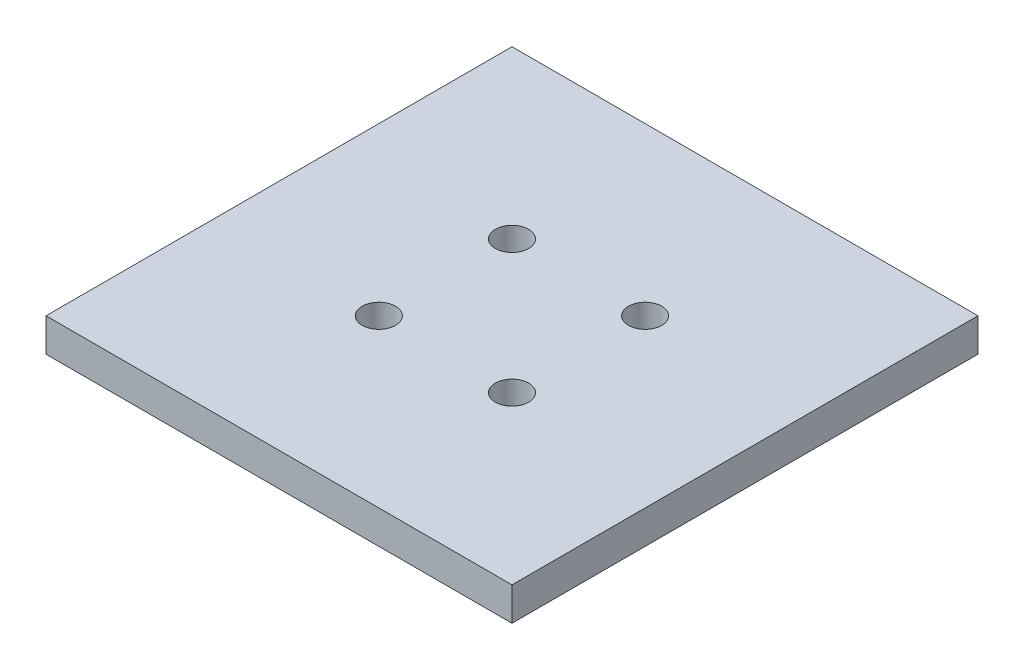
ISO-10303-21;
HEADER;
FILE_DESCRIPTION(('STEP AP214'),'2;1');
FILE_NAME('part.step','',(''),(''),'','','');
FILE_SCHEMA(('AUTOMOTIVE_DESIGN { 1 0 10303 214 1 1 1 1 }'));
ENDSEC;
DATA;
#1=APPLICATION_CONTEXT('core data for automotive mechanical design processes');
#2=APPLICATION_PROTOCOL_DEFINITION('international standard','automotive_design',2000,#1);
#3=PRODUCT_CONTEXT('',#1,'mechanical');
#4=PRODUCT('Part','Part','',(#3));
#5=PRODUCT_RELATED_PRODUCT_CATEGORY('part','',(#4));
#6=PRODUCT_DEFINITION_FORMATION('','',#4);
#7=PRODUCT_DEFINITION_CONTEXT('part definition',#1,'design');
#8=PRODUCT_DEFINITION('design','',#6,#7);
#9=PRODUCT_DEFINITION_SHAPE('','',#8);
#10=(LENGTH_UNIT() NAMED_UNIT(*) SI_UNIT(.MILLI.,.METRE.));
#11=(NAMED_UNIT(*) PLANE_ANGLE_UNIT() SI_UNIT($,.RADIAN.));
#12=(NAMED_UNIT(*) SI_UNIT($,.STERADIAN.) SOLID_ANGLE_UNIT());
#13=UNCERTAINTY_MEASURE_WITH_UNIT(LENGTH_MEASURE(1.E-05),#10,'distance_accuracy_value','');
#14=(GEOMETRIC_REPRESENTATION_CONTEXT(3) GLOBAL_UNCERTAINTY_ASSIGNED_CONTEXT((#13)) GLOBAL_UNIT_ASSIGNED_CONTEXT((#10,
#11,#12)) REPRESENTATION_CONTEXT('',''));
#15=CARTESIAN_POINT('',(0.,0.,0.));
#16=DIRECTION('',(0.,0.,1.));
#17=DIRECTION('',(1.,0.,0.));
#18=AXIS2_PLACEMENT_3D('',#15,#16,#17);
#19=CARTESIAN_POINT('',(0.,6.35,0.));
#20=DIRECTION('',(0.,-1.,0.));
#21=DIRECTION('',(0.,0.,-1.));
#22=AXIS2_PLACEMENT_3D('',#19,#20,#21);
#23=PLANE('',#22);
#24=DIRECTION('',(0.,0.,-1.));
#25=VECTOR('',#24,1.);
#26=CARTESIAN_POINT('',(44.45,6.35,44.45));
#27=LINE('',#26,#25);
#28=CARTESIAN_POINT('',(44.45,6.35,44.45));
#29=VERTEX_POINT('',#28);
#30=CARTESIAN_POINT('',(44.45,6.35,-44.45));
#31=VERTEX_POINT('',#30);
#32=EDGE_CURVE('E92',#29,#31,#27,.T.);
#33=ORIENTED_EDGE('',*,*,#32,.T.);
#34=DIRECTION('',(-1.,0.,0.));
#35=VECTOR('',#34,1.);
#36=CARTESIAN_POINT('',(-44.45,6.35,-44.45));
#37=LINE('',#36,#35);
#38=CARTESIAN_POINT('',(-44.45,6.35,-44.45));
#39=VERTEX_POINT('',#38);
#40=EDGE_CURVE('E87',#31,#39,#37,.T.);
#41=ORIENTED_EDGE('',*,*,#40,.T.);
#42=DIRECTION('',(0.,0.,1.));
#43=VECTOR('',#42,1.);
#44=CARTESIAN_POINT('',(-44.45,6.35,44.45));
#45=LINE('',#44,#43);
#46=CARTESIAN_POINT('',(-44.45,6.35,44.45));
#47=VERTEX_POINT('',#46);
#48=EDGE_CURVE('E90',#39,#47,#45,.T.);
#49=ORIENTED_EDGE('',*,*,#48,.T.);
#50=DIRECTION('',(1.,0.,0.));
#51=VECTOR('',#50,1.);
#52=CARTESIAN_POINT('',(-44.45,6.35,44.45));
#53=LINE('',#52,#51);
#54=EDGE_CURVE('E57',#47,#29,#53,.T.);
#55=ORIENTED_EDGE('',*,*,#54,.T.);
#56=EDGE_LOOP('',(#33,#41,#49,#55));
#57=FACE_BOUND('',#56,.T.);
#58=CARTESIAN_POINT('',(12.7,6.35,-12.7));
#59=DIRECTION('',(0.,1.,0.));
#60=DIRECTION('',(0.,0.,1.));
#61=AXIS2_PLACEMENT_3D('',#58,#59,#60);
#62=CIRCLE('',#61,3.175);
#63=CARTESIAN_POINT('',(12.7,6.35,-9.52500000000001));
#64=VERTEX_POINT('',#63);
#65=EDGE_CURVE('E112',#64,#64,#62,.T.);
#66=ORIENTED_EDGE('',*,*,#65,.F.);
#67=EDGE_LOOP('',(#66));
#68=FACE_BOUND('',#67,.T.);
#69=CARTESIAN_POINT('',(12.7,6.35,12.7));
#70=DIRECTION('',(0.,1.,0.));
#71=DIRECTION('',(0.,0.,1.));
#72=AXIS2_PLACEMENT_3D('',#69,#70,#71);
#73=CIRCLE('',#72,3.175);
#74=CARTESIAN_POINT('',(12.7,6.35,15.875));
#75=VERTEX_POINT('',#74);
#76=EDGE_CURVE('E134',#75,#75,#73,.T.);
#77=ORIENTED_EDGE('',*,*,#76,.F.);
#78=EDGE_LOOP('',(#77));
#79=FACE_BOUND('',#78,.T.);
#80=CARTESIAN_POINT('',(-12.7,6.35,12.7));
#81=DIRECTION('',(0.,1.,0.));
#82=DIRECTION('',(0.,0.,1.));
#83=AXIS2_PLACEMENT_3D('',#80,#81,#82);
#84=CIRCLE('',#83,3.175);
#85=CARTESIAN_POINT('',(-12.7,6.35,15.875));
#86=VERTEX_POINT('',#85);
#87=EDGE_CURVE('E142',#86,#86,#84,.T.);
#88=ORIENTED_EDGE('',*,*,#87,.F.);
#89=EDGE_LOOP('',(#88));
#90=FACE_BOUND('',#89,.T.);
#91=CARTESIAN_POINT('',(-12.7,6.35,-12.7));
#92=DIRECTION('',(0.,1.,0.));
#93=DIRECTION('',(0.,0.,1.));
#94=AXIS2_PLACEMENT_3D('',#91,#92,#93);
#95=CIRCLE('',#94,3.175);
#96=CARTESIAN_POINT('',(-12.7,6.35,-9.52500000000001));
#97=VERTEX_POINT('',#96);
#98=EDGE_CURVE('E150',#97,#97,#95,.T.);
#99=ORIENTED_EDGE('',*,*,#98,.F.);
#100=EDGE_LOOP('',(#99));
#101=FACE_BOUND('',#100,.T.);
#102=ADVANCED_FACE('F39',(#57,#68,#79,#90,#101),#23,.F.);
#103=CARTESIAN_POINT('',(0.,0.,0.));
#104=DIRECTION('',(0.,-1.,0.));
#105=DIRECTION('',(0.,0.,-1.));
#106=AXIS2_PLACEMENT_3D('',#103,#104,#105);
#107=PLANE('',#106);
#108=CARTESIAN_POINT('',(-12.7,0.,12.7));
#109=DIRECTION('',(0.,1.,0.));
#110=DIRECTION('',(0.,0.,1.));
#111=AXIS2_PLACEMENT_3D('',#108,#109,#110);
#112=CIRCLE('',#111,3.175);
#113=CARTESIAN_POINT('',(-12.7,0.,15.875));
#114=VERTEX_POINT('',#113);
#115=EDGE_CURVE('E146',#114,#114,#112,.T.);
#116=ORIENTED_EDGE('',*,*,#115,.T.);
#117=EDGE_LOOP('',(#116));
#118=FACE_BOUND('',#117,.T.);
#119=CARTESIAN_POINT('',(12.7,0.,-12.7));
#120=DIRECTION('',(0.,1.,0.));
#121=DIRECTION('',(0.,0.,1.));
#122=AXIS2_PLACEMENT_3D('',#119,#120,#121);
#123=CIRCLE('',#122,3.175);
#124=CARTESIAN_POINT('',(12.7,0.,-9.52500000000001));
#125=VERTEX_POINT('',#124);
#126=EDGE_CURVE('E130',#125,#125,#123,.T.);
#127=ORIENTED_EDGE('',*,*,#126,.T.);
#128=EDGE_LOOP('',(#127));
#129=FACE_BOUND('',#128,.T.);
#130=DIRECTION('',(0.,0.,-1.));
#131=VECTOR('',#130,1.);
#132=CARTESIAN_POINT('',(44.45,0.,44.45));
#133=LINE('',#132,#131);
#134=CARTESIAN_POINT('',(44.45,0.,44.45));
#135=VERTEX_POINT('',#134);
#136=CARTESIAN_POINT('',(44.45,0.,-44.45));
#137=VERTEX_POINT('',#136);
#138=EDGE_CURVE('E108',#135,#137,#133,.T.);
#139=ORIENTED_EDGE('',*,*,#138,.F.);
#140=DIRECTION('',(1.,0.,0.));
#141=VECTOR('',#140,1.);
#142=CARTESIAN_POINT('',(-44.45,0.,44.45));
#143=LINE('',#142,#141);
#144=CARTESIAN_POINT('',(-44.45,0.,44.45));
#145=VERTEX_POINT('',#144);
#146=EDGE_CURVE('E80',#145,#135,#143,.T.);
#147=ORIENTED_EDGE('',*,*,#146,.F.);
#148=DIRECTION('',(0.,0.,1.));
#149=VECTOR('',#148,1.);
#150=CARTESIAN_POINT('',(-44.45,0.,44.45));
#151=LINE('',#150,#149);
#152=CARTESIAN_POINT('',(-44.45,0.,-44.45));
#153=VERTEX_POINT('',#152);
#154=EDGE_CURVE('E74',#153,#145,#151,.T.);
#155=ORIENTED_EDGE('',*,*,#154,.F.);
#156=DIRECTION('',(-1.,0.,0.));
#157=VECTOR('',#156,1.);
#158=CARTESIAN_POINT('',(-44.45,0.,-44.45));
#159=LINE('',#158,#157);
#160=EDGE_CURVE('E97',#137,#153,#159,.T.);
#161=ORIENTED_EDGE('',*,*,#160,.F.);
#162=EDGE_LOOP('',(#139,#147,#155,#161));
#163=FACE_BOUND('',#162,.T.);
#164=CARTESIAN_POINT('',(12.7,0.,12.7));
#165=DIRECTION('',(0.,1.,0.));
#166=DIRECTION('',(0.,0.,1.));
#167=AXIS2_PLACEMENT_3D('',#164,#165,#166);
#168=CIRCLE('',#167,3.175);
#169=CARTESIAN_POINT('',(12.7,0.,15.875));
#170=VERTEX_POINT('',#169);
#171=EDGE_CURVE('E138',#170,#170,#168,.T.);
#172=ORIENTED_EDGE('',*,*,#171,.T.);
#173=EDGE_LOOP('',(#172));
#174=FACE_BOUND('',#173,.T.);
#175=CARTESIAN_POINT('',(-12.7,0.,-12.7));
#176=DIRECTION('',(0.,1.,0.));
#177=DIRECTION('',(0.,0.,1.));
#178=AXIS2_PLACEMENT_3D('',#175,#176,#177);
#179=CIRCLE('',#178,3.175);
#180=CARTESIAN_POINT('',(-12.7,0.,-9.52500000000001));
#181=VERTEX_POINT('',#180);
#182=EDGE_CURVE('E154',#181,#181,#179,.T.);
#183=ORIENTED_EDGE('',*,*,#182,.T.);
#184=EDGE_LOOP('',(#183));
#185=FACE_BOUND('',#184,.T.);
#186=ADVANCED_FACE('F125',(#118,#129,#163,#174,#185),#107,.T.);
#187=CARTESIAN_POINT('',(44.45,6.35,44.45));
#188=DIRECTION('',(-1.,0.,0.));
#189=DIRECTION('',(0.,0.,1.));
#190=AXIS2_PLACEMENT_3D('',#187,#188,#189);
#191=PLANE('',#190);
#192=ORIENTED_EDGE('',*,*,#138,.T.);
#193=DIRECTION('',(0.,-1.,0.));
#194=VECTOR('',#193,1.);
#195=CARTESIAN_POINT('',(44.45,6.35,-44.45));
#196=LINE('',#195,#194);
#197=EDGE_CURVE('E11',#31,#137,#196,.T.);
#198=ORIENTED_EDGE('',*,*,#197,.F.);
#199=ORIENTED_EDGE('',*,*,#32,.F.);
#200=DIRECTION('',(0.,-1.,0.));
#201=VECTOR('',#200,1.);
#202=CARTESIAN_POINT('',(44.45,6.35,44.45));
#203=LINE('',#202,#201);
#204=EDGE_CURVE('E104',#29,#135,#203,.T.);
#205=ORIENTED_EDGE('',*,*,#204,.T.);
#206=EDGE_LOOP('',(#192,#198,#199,#205));
#207=FACE_BOUND('',#206,.T.);
#208=ADVANCED_FACE('F41',(#207),#191,.F.);
#209=CARTESIAN_POINT('',(-44.45,6.35,-44.45));
#210=DIRECTION('',(0.,0.,1.));
#211=DIRECTION('',(1.,0.,0.));
#212=AXIS2_PLACEMENT_3D('',#209,#210,#211);
#213=PLANE('',#212);
#214=ORIENTED_EDGE('',*,*,#160,.T.);
#215=DIRECTION('',(0.,-1.,0.));
#216=VECTOR('',#215,1.);
#217=CARTESIAN_POINT('',(-44.45,6.35,-44.45));
#218=LINE('',#217,#216);
#219=EDGE_CURVE('E49',#39,#153,#218,.T.);
#220=ORIENTED_EDGE('',*,*,#219,.F.);
#221=ORIENTED_EDGE('',*,*,#40,.F.);
#222=ORIENTED_EDGE('',*,*,#197,.T.);
#223=EDGE_LOOP('',(#214,#220,#221,#222));
#224=FACE_BOUND('',#223,.T.);
#225=ADVANCED_FACE('F96',(#224),#213,.F.);
#226=CARTESIAN_POINT('',(-44.45,6.35,44.45));
#227=DIRECTION('',(1.,0.,0.));
#228=DIRECTION('',(0.,0.,-1.));
#229=AXIS2_PLACEMENT_3D('',#226,#227,#228);
#230=PLANE('',#229);
#231=ORIENTED_EDGE('',*,*,#154,.T.);
#232=DIRECTION('',(0.,-1.,0.));
#233=VECTOR('',#232,1.);
#234=CARTESIAN_POINT('',(-44.45,6.35,44.45));
#235=LINE('',#234,#233);
#236=EDGE_CURVE('E99',#47,#145,#235,.T.);
#237=ORIENTED_EDGE('',*,*,#236,.F.);
#238=ORIENTED_EDGE('',*,*,#48,.F.);
#239=ORIENTED_EDGE('',*,*,#219,.T.);
#240=EDGE_LOOP('',(#231,#237,#238,#239));
#241=FACE_BOUND('',#240,.T.);
#242=ADVANCED_FACE('F100',(#241),#230,.F.);
#243=CARTESIAN_POINT('',(-44.45,6.35,44.45));
#244=DIRECTION('',(0.,0.,-1.));
#245=DIRECTION('',(-1.,0.,0.));
#246=AXIS2_PLACEMENT_3D('',#243,#244,#245);
#247=PLANE('',#246);
#248=ORIENTED_EDGE('',*,*,#146,.T.);
#249=ORIENTED_EDGE('',*,*,#204,.F.);
#250=ORIENTED_EDGE('',*,*,#54,.F.);
#251=ORIENTED_EDGE('',*,*,#236,.T.);
#252=EDGE_LOOP('',(#248,#249,#250,#251));
#253=FACE_BOUND('',#252,.T.);
#254=ADVANCED_FACE('F122',(#253),#247,.F.);
#255=CARTESIAN_POINT('',(12.7,6.35,-12.7));
#256=DIRECTION('',(0.,-1.,0.));
#257=DIRECTION('',(0.,0.,-1.));
#258=AXIS2_PLACEMENT_3D('',#255,#256,#257);
#259=CYLINDRICAL_SURFACE('',#258,3.175);
#260=ORIENTED_EDGE('',*,*,#65,.T.);
#261=EDGE_LOOP('',(#260));
#262=FACE_BOUND('',#261,.T.);
#263=ORIENTED_EDGE('',*,*,#126,.F.);
#264=EDGE_LOOP('',(#263));
#265=FACE_BOUND('',#264,.T.);
#266=ADVANCED_FACE('F173',(#262,#265),#259,.F.);
#267=CARTESIAN_POINT('',(12.7,6.35,12.7));
#268=DIRECTION('',(0.,-1.,0.));
#269=DIRECTION('',(0.,0.,-1.));
#270=AXIS2_PLACEMENT_3D('',#267,#268,#269);
#271=CYLINDRICAL_SURFACE('',#270,3.175);
#272=ORIENTED_EDGE('',*,*,#76,.T.);
#273=EDGE_LOOP('',(#272));
#274=FACE_BOUND('',#273,.T.);
#275=ORIENTED_EDGE('',*,*,#171,.F.);
#276=EDGE_LOOP('',(#275));
#277=FACE_BOUND('',#276,.T.);
#278=ADVANCED_FACE('F219',(#274,#277),#271,.F.);
#279=CARTESIAN_POINT('',(-12.7,6.35,12.7));
#280=DIRECTION('',(0.,-1.,0.));
#281=DIRECTION('',(0.,0.,-1.));
#282=AXIS2_PLACEMENT_3D('',#279,#280,#281);
#283=CYLINDRICAL_SURFACE('',#282,3.175);
#284=ORIENTED_EDGE('',*,*,#87,.T.);
#285=EDGE_LOOP('',(#284));
#286=FACE_BOUND('',#285,.T.);
#287=ORIENTED_EDGE('',*,*,#115,.F.);
#288=EDGE_LOOP('',(#287));
#289=FACE_BOUND('',#288,.T.);
#290=ADVANCED_FACE('F227',(#286,#289),#283,.F.);
#291=CARTESIAN_POINT('',(-12.7,6.35,-12.7));
#292=DIRECTION('',(0.,-1.,0.));
#293=DIRECTION('',(0.,0.,-1.));
#294=AXIS2_PLACEMENT_3D('',#291,#292,#293);
#295=CYLINDRICAL_SURFACE('',#294,3.175);
#296=ORIENTED_EDGE('',*,*,#98,.T.);
#297=EDGE_LOOP('',(#296));
#298=FACE_BOUND('',#297,.T.);
#299=ORIENTED_EDGE('',*,*,#182,.F.);
#300=EDGE_LOOP('',(#299));
#301=FACE_BOUND('',#300,.T.);
#302=ADVANCED_FACE('F162',(#298,#301),#295,.F.);
#303=CLOSED_SHELL('',(#102,#186,#208,#225,#242,#254,#266,#278,#290,#302));
#304=MANIFOLD_SOLID_BREP('B2',#303);
#305=ADVANCED_BREP_SHAPE_REPRESENTATION('',(#18,#304),#14);
#306=SHAPE_DEFINITION_REPRESENTATION(#9,#305);
ENDSEC;
END-ISO-10303-21;
